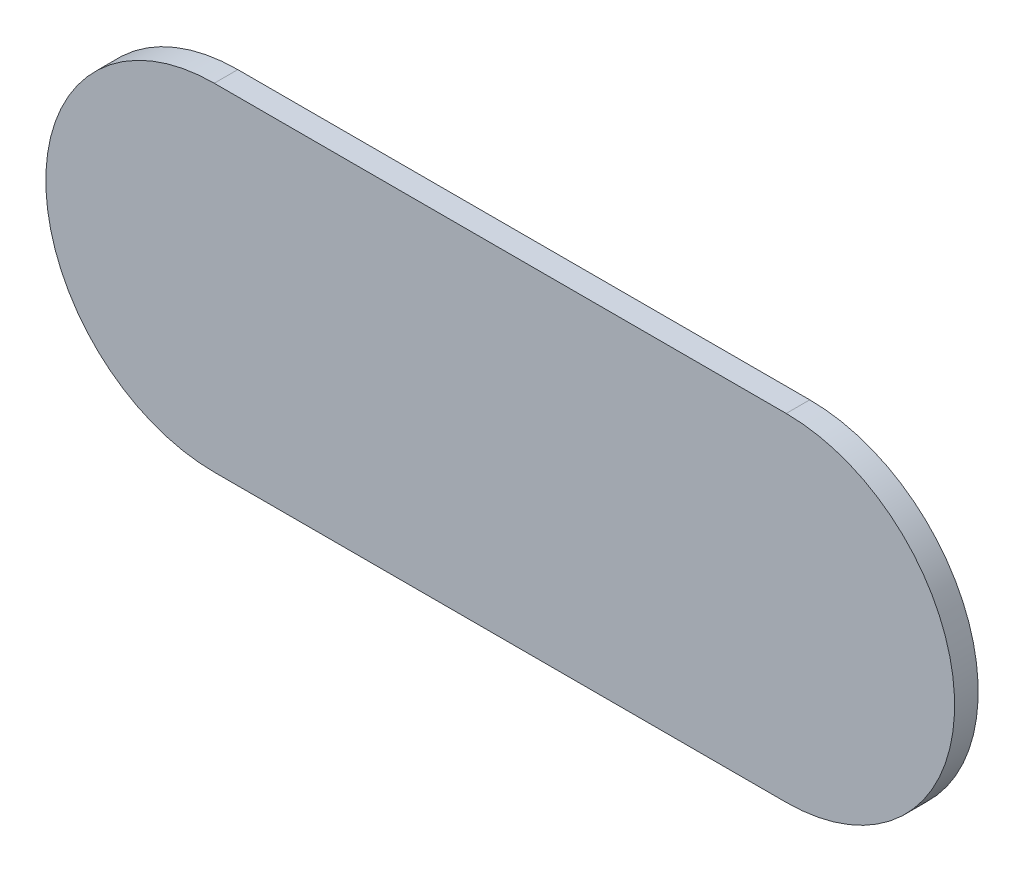
ISO-10303-21;
HEADER;
FILE_DESCRIPTION(('STEP AP214'),'2;1');
FILE_NAME('part.step','',(''),(''),'','','');
FILE_SCHEMA(('AUTOMOTIVE_DESIGN { 1 0 10303 214 1 1 1 1 }'));
ENDSEC;
DATA;
#1=APPLICATION_CONTEXT('core data for automotive mechanical design processes');
#2=APPLICATION_PROTOCOL_DEFINITION('international standard','automotive_design',2000,#1);
#3=PRODUCT_CONTEXT('',#1,'mechanical');
#4=PRODUCT('Part','Part','',(#3));
#5=PRODUCT_RELATED_PRODUCT_CATEGORY('part','',(#4));
#6=PRODUCT_DEFINITION_FORMATION('','',#4);
#7=PRODUCT_DEFINITION_CONTEXT('part definition',#1,'design');
#8=PRODUCT_DEFINITION('design','',#6,#7);
#9=PRODUCT_DEFINITION_SHAPE('','',#8);
#10=(LENGTH_UNIT() NAMED_UNIT(*) SI_UNIT(.MILLI.,.METRE.));
#11=(NAMED_UNIT(*) PLANE_ANGLE_UNIT() SI_UNIT($,.RADIAN.));
#12=(NAMED_UNIT(*) SI_UNIT($,.STERADIAN.) SOLID_ANGLE_UNIT());
#13=UNCERTAINTY_MEASURE_WITH_UNIT(LENGTH_MEASURE(1.E-05),#10,'distance_accuracy_value','');
#14=(GEOMETRIC_REPRESENTATION_CONTEXT(3) GLOBAL_UNCERTAINTY_ASSIGNED_CONTEXT((#13)) GLOBAL_UNIT_ASSIGNED_CONTEXT((#10,
#11,#12)) REPRESENTATION_CONTEXT('',''));
#15=CARTESIAN_POINT('',(0.,0.,0.));
#16=DIRECTION('',(0.,0.,1.));
#17=DIRECTION('',(1.,0.,0.));
#18=AXIS2_PLACEMENT_3D('',#15,#16,#17);
#19=CARTESIAN_POINT('',(112.251,-118.34,1.635));
#20=DIRECTION('',(0.,0.,1.));
#21=DIRECTION('',(1.,0.,0.));
#22=AXIS2_PLACEMENT_3D('',#19,#20,#21);
#23=PLANE('',#22);
#24=DIRECTION('',(1.,0.,0.));
#25=VECTOR('',#24,1.);
#26=CARTESIAN_POINT('',(112.251,-118.34,1.635));
#27=LINE('',#26,#25);
#28=CARTESIAN_POINT('',(112.251,-118.34,1.635));
#29=VERTEX_POINT('',#28);
#30=CARTESIAN_POINT('',(113.1,-118.34,1.635));
#31=VERTEX_POINT('',#30);
#32=EDGE_CURVE('E92',#29,#31,#27,.T.);
#33=ORIENTED_EDGE('',*,*,#32,.T.);
#34=CARTESIAN_POINT('',(113.1,-118.09,1.635));
#35=DIRECTION('',(0.,0.,1.));
#36=DIRECTION('',(0.,-1.,0.));
#37=AXIS2_PLACEMENT_3D('',#34,#35,#36);
#38=CIRCLE('',#37,0.25);
#39=CARTESIAN_POINT('',(113.1,-117.84,1.635));
#40=VERTEX_POINT('',#39);
#41=EDGE_CURVE('E72',#31,#40,#38,.T.);
#42=ORIENTED_EDGE('',*,*,#41,.T.);
#43=DIRECTION('',(-1.,0.,0.));
#44=VECTOR('',#43,1.);
#45=CARTESIAN_POINT('',(113.1,-117.84,1.635));
#46=LINE('',#45,#44);
#47=CARTESIAN_POINT('',(112.251,-117.84,1.635));
#48=VERTEX_POINT('',#47);
#49=EDGE_CURVE('E85',#40,#48,#46,.T.);
#50=ORIENTED_EDGE('',*,*,#49,.T.);
#51=CARTESIAN_POINT('',(112.251,-118.09,1.635));
#52=DIRECTION('',(0.,0.,1.));
#53=DIRECTION('',(0.,1.,0.));
#54=AXIS2_PLACEMENT_3D('',#51,#52,#53);
#55=CIRCLE('',#54,0.25);
#56=EDGE_CURVE('E11',#48,#29,#55,.T.);
#57=ORIENTED_EDGE('',*,*,#56,.T.);
#58=EDGE_LOOP('',(#33,#42,#50,#57));
#59=FACE_BOUND('',#58,.T.);
#60=ADVANCED_FACE('F17',(#59),#23,.T.);
#61=CARTESIAN_POINT('',(112.251,-118.34,1.6));
#62=DIRECTION('',(0.,0.,1.));
#63=DIRECTION('',(1.,0.,0.));
#64=AXIS2_PLACEMENT_3D('',#61,#62,#63);
#65=PLANE('',#64);
#66=CARTESIAN_POINT('',(112.251,-118.09,1.6));
#67=DIRECTION('',(0.,0.,1.));
#68=DIRECTION('',(0.,1.,0.));
#69=AXIS2_PLACEMENT_3D('',#66,#67,#68);
#70=CIRCLE('',#69,0.25);
#71=CARTESIAN_POINT('',(112.251,-117.84,1.6));
#72=VERTEX_POINT('',#71);
#73=CARTESIAN_POINT('',(112.251,-118.34,1.6));
#74=VERTEX_POINT('',#73);
#75=EDGE_CURVE('E25',#72,#74,#70,.T.);
#76=ORIENTED_EDGE('',*,*,#75,.F.);
#77=DIRECTION('',(-1.,0.,0.));
#78=VECTOR('',#77,1.);
#79=CARTESIAN_POINT('',(113.1,-117.84,1.6));
#80=LINE('',#79,#78);
#81=CARTESIAN_POINT('',(113.1,-117.84,1.6));
#82=VERTEX_POINT('',#81);
#83=EDGE_CURVE('E57',#82,#72,#80,.T.);
#84=ORIENTED_EDGE('',*,*,#83,.F.);
#85=CARTESIAN_POINT('',(113.1,-118.09,1.6));
#86=DIRECTION('',(0.,0.,1.));
#87=DIRECTION('',(0.,-1.,0.));
#88=AXIS2_PLACEMENT_3D('',#85,#86,#87);
#89=CIRCLE('',#88,0.25);
#90=CARTESIAN_POINT('',(113.1,-118.34,1.6));
#91=VERTEX_POINT('',#90);
#92=EDGE_CURVE('E94',#91,#82,#89,.T.);
#93=ORIENTED_EDGE('',*,*,#92,.F.);
#94=DIRECTION('',(1.,0.,0.));
#95=VECTOR('',#94,1.);
#96=CARTESIAN_POINT('',(112.251,-118.34,1.6));
#97=LINE('',#96,#95);
#98=EDGE_CURVE('E91',#74,#91,#97,.T.);
#99=ORIENTED_EDGE('',*,*,#98,.F.);
#100=EDGE_LOOP('',(#76,#84,#93,#99));
#101=FACE_BOUND('',#100,.T.);
#102=ADVANCED_FACE('F96',(#101),#65,.F.);
#103=CARTESIAN_POINT('',(112.251,-118.09,1.6));
#104=DIRECTION('',(0.,0.,-1.));
#105=DIRECTION('',(0.,1.,0.));
#106=AXIS2_PLACEMENT_3D('',#103,#104,#105);
#107=CYLINDRICAL_SURFACE('',#106,0.25);
#108=ORIENTED_EDGE('',*,*,#75,.T.);
#109=DIRECTION('',(0.,0.,1.));
#110=VECTOR('',#109,1.);
#111=CARTESIAN_POINT('',(112.251,-118.34,1.6));
#112=LINE('',#111,#110);
#113=EDGE_CURVE('E80',#74,#29,#112,.T.);
#114=ORIENTED_EDGE('',*,*,#113,.T.);
#115=ORIENTED_EDGE('',*,*,#56,.F.);
#116=DIRECTION('',(0.,0.,1.));
#117=VECTOR('',#116,1.);
#118=CARTESIAN_POINT('',(112.251,-117.84,1.6));
#119=LINE('',#118,#117);
#120=EDGE_CURVE('E83',#72,#48,#119,.T.);
#121=ORIENTED_EDGE('',*,*,#120,.F.);
#122=EDGE_LOOP('',(#108,#114,#115,#121));
#123=FACE_BOUND('',#122,.T.);
#124=ADVANCED_FACE('F79',(#123),#107,.T.);
#125=CARTESIAN_POINT('',(113.1,-117.84,1.6));
#126=DIRECTION('',(0.,-1.,0.));
#127=DIRECTION('',(0.,0.,-1.));
#128=AXIS2_PLACEMENT_3D('',#125,#126,#127);
#129=PLANE('',#128);
#130=ORIENTED_EDGE('',*,*,#83,.T.);
#131=ORIENTED_EDGE('',*,*,#120,.T.);
#132=ORIENTED_EDGE('',*,*,#49,.F.);
#133=DIRECTION('',(0.,0.,1.));
#134=VECTOR('',#133,1.);
#135=CARTESIAN_POINT('',(113.1,-117.84,1.6));
#136=LINE('',#135,#134);
#137=EDGE_CURVE('E108',#82,#40,#136,.T.);
#138=ORIENTED_EDGE('',*,*,#137,.F.);
#139=EDGE_LOOP('',(#130,#131,#132,#138));
#140=FACE_BOUND('',#139,.T.);
#141=ADVANCED_FACE('F122',(#140),#129,.F.);
#142=CARTESIAN_POINT('',(113.1,-118.09,1.6));
#143=DIRECTION('',(0.,0.,-1.));
#144=DIRECTION('',(0.,-1.,0.));
#145=AXIS2_PLACEMENT_3D('',#142,#143,#144);
#146=CYLINDRICAL_SURFACE('',#145,0.25);
#147=ORIENTED_EDGE('',*,*,#92,.T.);
#148=ORIENTED_EDGE('',*,*,#137,.T.);
#149=ORIENTED_EDGE('',*,*,#41,.F.);
#150=DIRECTION('',(0.,0.,1.));
#151=VECTOR('',#150,1.);
#152=CARTESIAN_POINT('',(113.1,-118.34,1.6));
#153=LINE('',#152,#151);
#154=EDGE_CURVE('E99',#91,#31,#153,.T.);
#155=ORIENTED_EDGE('',*,*,#154,.F.);
#156=EDGE_LOOP('',(#147,#148,#149,#155));
#157=FACE_BOUND('',#156,.T.);
#158=ADVANCED_FACE('F164',(#157),#146,.T.);
#159=CARTESIAN_POINT('',(112.251,-118.34,1.6));
#160=DIRECTION('',(0.,1.,0.));
#161=DIRECTION('',(1.,0.,0.));
#162=AXIS2_PLACEMENT_3D('',#159,#160,#161);
#163=PLANE('',#162);
#164=ORIENTED_EDGE('',*,*,#98,.T.);
#165=ORIENTED_EDGE('',*,*,#154,.T.);
#166=ORIENTED_EDGE('',*,*,#32,.F.);
#167=ORIENTED_EDGE('',*,*,#113,.F.);
#168=EDGE_LOOP('',(#164,#165,#166,#167));
#169=FACE_BOUND('',#168,.T.);
#170=ADVANCED_FACE('F89',(#169),#163,.F.);
#171=CLOSED_SHELL('',(#60,#102,#124,#141,#158,#170));
#172=MANIFOLD_SOLID_BREP('B1',#171);
#173=ADVANCED_BREP_SHAPE_REPRESENTATION('',(#18,#172),#14);
#174=SHAPE_DEFINITION_REPRESENTATION(#9,#173);
ENDSEC;
END-ISO-10303-21;
